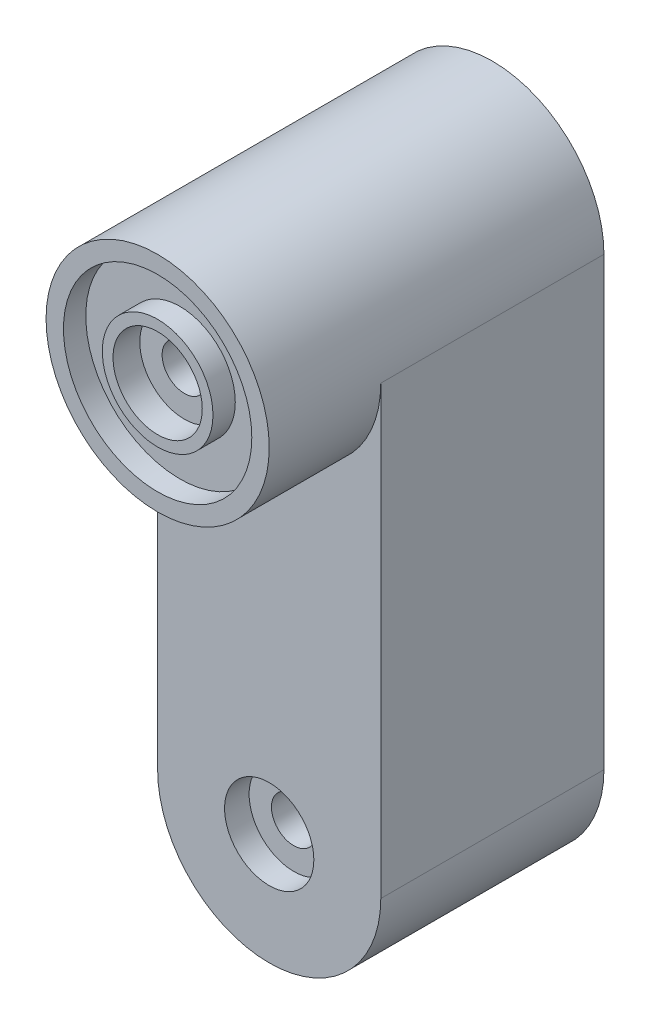
ISO-10303-21;
HEADER;
FILE_DESCRIPTION(('STEP AP214'),'2;1');
FILE_NAME('part.step','',(''),(''),'','','');
FILE_SCHEMA(('AUTOMOTIVE_DESIGN { 1 0 10303 214 1 1 1 1 }'));
ENDSEC;
DATA;
#1=APPLICATION_CONTEXT('core data for automotive mechanical design processes');
#2=APPLICATION_PROTOCOL_DEFINITION('international standard','automotive_design',2000,#1);
#3=PRODUCT_CONTEXT('',#1,'mechanical');
#4=PRODUCT('Part','Part','',(#3));
#5=PRODUCT_RELATED_PRODUCT_CATEGORY('part','',(#4));
#6=PRODUCT_DEFINITION_FORMATION('','',#4);
#7=PRODUCT_DEFINITION_CONTEXT('part definition',#1,'design');
#8=PRODUCT_DEFINITION('design','',#6,#7);
#9=PRODUCT_DEFINITION_SHAPE('','',#8);
#10=(LENGTH_UNIT() NAMED_UNIT(*) SI_UNIT(.MILLI.,.METRE.));
#11=(NAMED_UNIT(*) PLANE_ANGLE_UNIT() SI_UNIT($,.RADIAN.));
#12=(NAMED_UNIT(*) SI_UNIT($,.STERADIAN.) SOLID_ANGLE_UNIT());
#13=UNCERTAINTY_MEASURE_WITH_UNIT(LENGTH_MEASURE(1.E-05),#10,'distance_accuracy_value','');
#14=(GEOMETRIC_REPRESENTATION_CONTEXT(3) GLOBAL_UNCERTAINTY_ASSIGNED_CONTEXT((#13)) GLOBAL_UNIT_ASSIGNED_CONTEXT((#10,
#11,#12)) REPRESENTATION_CONTEXT('',''));
#15=CARTESIAN_POINT('',(0.,0.,0.));
#16=DIRECTION('',(0.,0.,1.));
#17=DIRECTION('',(1.,0.,0.));
#18=AXIS2_PLACEMENT_3D('',#15,#16,#17);
#19=CARTESIAN_POINT('',(0.,25.,-25.0000000000001));
#20=DIRECTION('',(0.,0.,1.));
#21=DIRECTION('',(1.,0.,0.));
#22=AXIS2_PLACEMENT_3D('',#19,#20,#21);
#23=CYLINDRICAL_SURFACE('',#22,5.);
#24=CARTESIAN_POINT('',(0.,25.,-19.5000000000001));
#25=DIRECTION('',(0.,0.,-1.));
#26=DIRECTION('',(-1.,0.,0.));
#27=AXIS2_PLACEMENT_3D('',#24,#25,#26);
#28=CIRCLE('',#27,5.);
#29=CARTESIAN_POINT('',(-4.99999999999997,25.,-19.5000000000001));
#30=VERTEX_POINT('',#29);
#31=EDGE_CURVE('E198',#30,#30,#28,.F.);
#32=ORIENTED_EDGE('',*,*,#31,.F.);
#33=EDGE_LOOP('',(#32));
#34=FACE_BOUND('',#33,.T.);
#35=CARTESIAN_POINT('',(0.,25.,19.4999999999999));
#36=DIRECTION('',(0.,0.,1.));
#37=DIRECTION('',(1.,0.,0.));
#38=AXIS2_PLACEMENT_3D('',#35,#36,#37);
#39=CIRCLE('',#38,5.);
#40=CARTESIAN_POINT('',(5.00000000000003,25.,19.4999999999999));
#41=VERTEX_POINT('',#40);
#42=EDGE_CURVE('E127',#41,#41,#39,.F.);
#43=ORIENTED_EDGE('',*,*,#42,.F.);
#44=EDGE_LOOP('',(#43));
#45=FACE_BOUND('',#44,.T.);
#46=ADVANCED_FACE('F123',(#34,#45),#23,.F.);
#47=CARTESIAN_POINT('',(0.,125.000000000001,-25.0000000000001));
#48=DIRECTION('',(0.,0.,1.));
#49=DIRECTION('',(1.,0.,0.));
#50=AXIS2_PLACEMENT_3D('',#47,#48,#49);
#51=CYLINDRICAL_SURFACE('',#50,5.);
#52=CARTESIAN_POINT('',(0.,125.000000000001,-19.5000000000001));
#53=DIRECTION('',(0.,0.,-1.));
#54=DIRECTION('',(-1.,0.,0.));
#55=AXIS2_PLACEMENT_3D('',#52,#53,#54);
#56=CIRCLE('',#55,5.);
#57=CARTESIAN_POINT('',(-4.99999999999998,125.000000000001,-19.5000000000001));
#58=VERTEX_POINT('',#57);
#59=EDGE_CURVE('E201',#58,#58,#56,.F.);
#60=ORIENTED_EDGE('',*,*,#59,.F.);
#61=EDGE_LOOP('',(#60));
#62=FACE_BOUND('',#61,.T.);
#63=CARTESIAN_POINT('',(0.,125.000000000001,43.9999999999999));
#64=DIRECTION('',(0.,0.,1.));
#65=DIRECTION('',(1.,0.,0.));
#66=AXIS2_PLACEMENT_3D('',#63,#64,#65);
#67=CIRCLE('',#66,5.);
#68=CARTESIAN_POINT('',(5.00000000000002,125.000000000001,43.9999999999999));
#69=VERTEX_POINT('',#68);
#70=EDGE_CURVE('E205',#69,#69,#67,.F.);
#71=ORIENTED_EDGE('',*,*,#70,.F.);
#72=EDGE_LOOP('',(#71));
#73=FACE_BOUND('',#72,.T.);
#74=ADVANCED_FACE('F263',(#62,#73),#51,.F.);
#75=CARTESIAN_POINT('',(0.,0.,49.9999999999999));
#76=DIRECTION('',(0.,0.,1.));
#77=DIRECTION('',(1.,0.,0.));
#78=AXIS2_PLACEMENT_3D('',#75,#76,#77);
#79=PLANE('',#78);
#80=CARTESIAN_POINT('',(0.,125.000000000001,49.9999999999999));
#81=DIRECTION('',(0.,0.,1.));
#82=DIRECTION('',(1.,0.,0.));
#83=AXIS2_PLACEMENT_3D('',#80,#81,#82);
#84=CIRCLE('',#83,10.);
#85=CARTESIAN_POINT('',(10.,125.000000000001,49.9999999999999));
#86=VERTEX_POINT('',#85);
#87=EDGE_CURVE('E215',#86,#86,#84,.T.);
#88=ORIENTED_EDGE('',*,*,#87,.F.);
#89=EDGE_LOOP('',(#88));
#90=FACE_BOUND('',#89,.T.);
#91=CARTESIAN_POINT('',(0.,125.000000000001,49.9999999999999));
#92=DIRECTION('',(0.,0.,1.));
#93=DIRECTION('',(1.,0.,0.));
#94=AXIS2_PLACEMENT_3D('',#91,#92,#93);
#95=CIRCLE('',#94,12.4);
#96=CARTESIAN_POINT('',(12.4,125.000000000001,49.9999999999999));
#97=VERTEX_POINT('',#96);
#98=EDGE_CURVE('E204',#97,#97,#95,.T.);
#99=ORIENTED_EDGE('',*,*,#98,.T.);
#100=EDGE_LOOP('',(#99));
#101=FACE_BOUND('',#100,.T.);
#102=ADVANCED_FACE('F270',(#90,#101),#79,.T.);
#103=CARTESIAN_POINT('',(0.,125.000000000001,49.9999999999999));
#104=DIRECTION('',(0.,0.,1.));
#105=DIRECTION('',(1.,0.,0.));
#106=AXIS2_PLACEMENT_3D('',#103,#104,#105);
#107=CIRCLE('',#106,21.1);
#108=CARTESIAN_POINT('',(21.1,125.000000000001,49.9999999999999));
#109=VERTEX_POINT('',#108);
#110=EDGE_CURVE('E235',#109,#109,#107,.T.);
#111=ORIENTED_EDGE('',*,*,#110,.F.);
#112=EDGE_LOOP('',(#111));
#113=FACE_BOUND('',#112,.T.);
#114=CARTESIAN_POINT('',(0.,125.000000000001,49.9999999999999));
#115=DIRECTION('',(0.,0.,1.));
#116=DIRECTION('',(1.,0.,0.));
#117=AXIS2_PLACEMENT_3D('',#114,#115,#116);
#118=CIRCLE('',#117,24.9999999999994);
#119=CARTESIAN_POINT('',(24.9999999999994,125.000000000001,49.9999999999999));
#120=VERTEX_POINT('',#119);
#121=EDGE_CURVE('E181',#120,#120,#118,.T.);
#122=ORIENTED_EDGE('',*,*,#121,.T.);
#123=EDGE_LOOP('',(#122));
#124=FACE_BOUND('',#123,.T.);
#125=ADVANCED_FACE('F332',(#113,#124),#79,.T.);
#126=CARTESIAN_POINT('',(-25.,150.,-25.0000000000001));
#127=DIRECTION('',(0.,0.,1.));
#128=DIRECTION('',(1.,0.,0.));
#129=AXIS2_PLACEMENT_3D('',#126,#127,#128);
#130=PLANE('',#129);
#131=CARTESIAN_POINT('',(0.,125.000000000001,-25.0000000000001));
#132=DIRECTION('',(0.,0.,-1.));
#133=DIRECTION('',(-1.,0.,0.));
#134=AXIS2_PLACEMENT_3D('',#131,#132,#133);
#135=CIRCLE('',#134,10.2);
#136=CARTESIAN_POINT('',(-10.2,125.000000000001,-25.0000000000001));
#137=VERTEX_POINT('',#136);
#138=EDGE_CURVE('E227',#137,#137,#135,.T.);
#139=ORIENTED_EDGE('',*,*,#138,.F.);
#140=EDGE_LOOP('',(#139));
#141=FACE_BOUND('',#140,.T.);
#142=CARTESIAN_POINT('',(0.,25.,-25.0000000000001));
#143=DIRECTION('',(0.,0.,-1.));
#144=DIRECTION('',(-1.,0.,0.));
#145=AXIS2_PLACEMENT_3D('',#142,#143,#144);
#146=CIRCLE('',#145,10.);
#147=CARTESIAN_POINT('',(-9.99999999999997,25.,-25.0000000000001));
#148=VERTEX_POINT('',#147);
#149=EDGE_CURVE('E212',#148,#148,#146,.T.);
#150=ORIENTED_EDGE('',*,*,#149,.F.);
#151=EDGE_LOOP('',(#150));
#152=FACE_BOUND('',#151,.T.);
#153=CARTESIAN_POINT('',(0.,125.000000000001,-25.0000000000001));
#154=DIRECTION('',(0.,0.,1.));
#155=DIRECTION('',(1.,0.,0.));
#156=AXIS2_PLACEMENT_3D('',#153,#154,#155);
#157=CIRCLE('',#156,24.9999999999994);
#158=CARTESIAN_POINT('',(-25.,125.000000000001,-25.0000000000001));
#159=VERTEX_POINT('',#158);
#160=CARTESIAN_POINT('',(25.,125.000000000001,-25.0000000000001));
#161=VERTEX_POINT('',#160);
#162=EDGE_CURVE('E180',#159,#161,#157,.F.);
#163=ORIENTED_EDGE('',*,*,#162,.T.);
#164=DIRECTION('',(0.,-1.,0.));
#165=VECTOR('',#164,1.);
#166=CARTESIAN_POINT('',(25.,150.,-25.0000000000001));
#167=LINE('',#166,#165);
#168=CARTESIAN_POINT('',(25.,25.,-25.0000000000001));
#169=VERTEX_POINT('',#168);
#170=EDGE_CURVE('E12',#161,#169,#167,.T.);
#171=ORIENTED_EDGE('',*,*,#170,.T.);
#172=CARTESIAN_POINT('',(0.,25.,-25.0000000000001));
#173=DIRECTION('',(0.,0.,1.));
#174=DIRECTION('',(1.,0.,0.));
#175=AXIS2_PLACEMENT_3D('',#172,#173,#174);
#176=CIRCLE('',#175,25.);
#177=CARTESIAN_POINT('',(-25.,25.,-25.0000000000001));
#178=VERTEX_POINT('',#177);
#179=EDGE_CURVE('E191',#178,#169,#176,.T.);
#180=ORIENTED_EDGE('',*,*,#179,.F.);
#181=DIRECTION('',(0.,-1.,0.));
#182=VECTOR('',#181,1.);
#183=CARTESIAN_POINT('',(-25.,150.,-25.0000000000001));
#184=LINE('',#183,#182);
#185=EDGE_CURVE('E132',#159,#178,#184,.T.);
#186=ORIENTED_EDGE('',*,*,#185,.F.);
#187=EDGE_LOOP('',(#163,#171,#180,#186));
#188=FACE_BOUND('',#187,.T.);
#189=ADVANCED_FACE('F247',(#141,#152,#188),#130,.F.);
#190=CARTESIAN_POINT('',(-25.,150.,24.9999999999999));
#191=DIRECTION('',(1.,0.,0.));
#192=DIRECTION('',(0.,0.,-1.));
#193=AXIS2_PLACEMENT_3D('',#190,#191,#192);
#194=PLANE('',#193);
#195=DIRECTION('',(0.,-1.,0.));
#196=VECTOR('',#195,1.);
#197=CARTESIAN_POINT('',(-25.,150.,24.9999999999999));
#198=LINE('',#197,#196);
#199=CARTESIAN_POINT('',(-25.,125.000000000001,24.9999999999999));
#200=VERTEX_POINT('',#199);
#201=CARTESIAN_POINT('',(-25.,25.,24.9999999999999));
#202=VERTEX_POINT('',#201);
#203=EDGE_CURVE('E165',#200,#202,#198,.T.);
#204=ORIENTED_EDGE('',*,*,#203,.F.);
#205=DIRECTION('',(0.,0.,1.));
#206=VECTOR('',#205,1.);
#207=CARTESIAN_POINT('',(-25.,125.000000000001,-60.355339059327));
#208=LINE('',#207,#206);
#209=EDGE_CURVE('E168',#159,#200,#208,.T.);
#210=ORIENTED_EDGE('',*,*,#209,.F.);
#211=ORIENTED_EDGE('',*,*,#185,.T.);
#212=DIRECTION('',(0.,0.,1.));
#213=VECTOR('',#212,1.);
#214=CARTESIAN_POINT('',(-25.,25.,-25.0000000000001));
#215=LINE('',#214,#213);
#216=EDGE_CURVE('E169',#178,#202,#215,.T.);
#217=ORIENTED_EDGE('',*,*,#216,.T.);
#218=EDGE_LOOP('',(#204,#210,#211,#217));
#219=FACE_BOUND('',#218,.T.);
#220=ADVANCED_FACE('F166',(#219),#194,.F.);
#221=CARTESIAN_POINT('',(-25.,150.,24.9999999999999));
#222=DIRECTION('',(0.,0.,-1.));
#223=DIRECTION('',(-1.,0.,0.));
#224=AXIS2_PLACEMENT_3D('',#221,#222,#223);
#225=PLANE('',#224);
#226=CARTESIAN_POINT('',(0.,25.,24.9999999999999));
#227=DIRECTION('',(0.,0.,1.));
#228=DIRECTION('',(1.,0.,0.));
#229=AXIS2_PLACEMENT_3D('',#226,#227,#228);
#230=CIRCLE('',#229,9.99999999999999);
#231=CARTESIAN_POINT('',(10.,25.,24.9999999999999));
#232=VERTEX_POINT('',#231);
#233=EDGE_CURVE('E222',#232,#232,#230,.T.);
#234=ORIENTED_EDGE('',*,*,#233,.F.);
#235=EDGE_LOOP('',(#234));
#236=FACE_BOUND('',#235,.T.);
#237=CARTESIAN_POINT('',(0.,25.,24.9999999999999));
#238=DIRECTION('',(0.,0.,1.));
#239=DIRECTION('',(1.,0.,0.));
#240=AXIS2_PLACEMENT_3D('',#237,#238,#239);
#241=CIRCLE('',#240,25.);
#242=CARTESIAN_POINT('',(25.,25.,24.9999999999999));
#243=VERTEX_POINT('',#242);
#244=EDGE_CURVE('E190',#202,#243,#241,.T.);
#245=ORIENTED_EDGE('',*,*,#244,.T.);
#246=DIRECTION('',(0.,-1.,0.));
#247=VECTOR('',#246,1.);
#248=CARTESIAN_POINT('',(25.,150.,24.9999999999999));
#249=LINE('',#248,#247);
#250=CARTESIAN_POINT('',(25.,125.000000000001,24.9999999999999));
#251=VERTEX_POINT('',#250);
#252=EDGE_CURVE('E140',#251,#243,#249,.T.);
#253=ORIENTED_EDGE('',*,*,#252,.F.);
#254=CARTESIAN_POINT('',(0.,125.000000000001,24.9999999999999));
#255=DIRECTION('',(0.,0.,-1.));
#256=DIRECTION('',(-1.,0.,0.));
#257=AXIS2_PLACEMENT_3D('',#254,#255,#256);
#258=CIRCLE('',#257,25.0000000000006);
#259=EDGE_CURVE('E171',#200,#251,#258,.F.);
#260=ORIENTED_EDGE('',*,*,#259,.F.);
#261=ORIENTED_EDGE('',*,*,#203,.T.);
#262=EDGE_LOOP('',(#245,#253,#260,#261));
#263=FACE_BOUND('',#262,.T.);
#264=ADVANCED_FACE('F172',(#236,#263),#225,.F.);
#265=CARTESIAN_POINT('',(25.,150.,24.9999999999999));
#266=DIRECTION('',(-1.,0.,0.));
#267=DIRECTION('',(0.,0.,1.));
#268=AXIS2_PLACEMENT_3D('',#265,#266,#267);
#269=PLANE('',#268);
#270=DIRECTION('',(0.,0.,1.));
#271=VECTOR('',#270,1.);
#272=CARTESIAN_POINT('',(25.,125.000000000001,-60.355339059327));
#273=LINE('',#272,#271);
#274=EDGE_CURVE('E176',#161,#251,#273,.T.);
#275=ORIENTED_EDGE('',*,*,#274,.T.);
#276=ORIENTED_EDGE('',*,*,#252,.T.);
#277=DIRECTION('',(0.,0.,1.));
#278=VECTOR('',#277,1.);
#279=CARTESIAN_POINT('',(25.,25.,-25.0000000000001));
#280=LINE('',#279,#278);
#281=EDGE_CURVE('E183',#169,#243,#280,.T.);
#282=ORIENTED_EDGE('',*,*,#281,.F.);
#283=ORIENTED_EDGE('',*,*,#170,.F.);
#284=EDGE_LOOP('',(#275,#276,#282,#283));
#285=FACE_BOUND('',#284,.T.);
#286=ADVANCED_FACE('F125',(#285),#269,.F.);
#287=CARTESIAN_POINT('',(0.,25.,-25.0000000000001));
#288=DIRECTION('',(0.,0.,1.));
#289=DIRECTION('',(1.,0.,0.));
#290=AXIS2_PLACEMENT_3D('',#287,#288,#289);
#291=CYLINDRICAL_SURFACE('',#290,25.);
#292=ORIENTED_EDGE('',*,*,#244,.F.);
#293=ORIENTED_EDGE('',*,*,#216,.F.);
#294=ORIENTED_EDGE('',*,*,#179,.T.);
#295=ORIENTED_EDGE('',*,*,#281,.T.);
#296=EDGE_LOOP('',(#292,#293,#294,#295));
#297=FACE_BOUND('',#296,.T.);
#298=ADVANCED_FACE('F249',(#297),#291,.T.);
#299=CARTESIAN_POINT('',(0.,125.000000000001,-60.355339059327));
#300=DIRECTION('',(0.,0.,1.));
#301=DIRECTION('',(1.,0.,0.));
#302=AXIS2_PLACEMENT_3D('',#299,#300,#301);
#303=CYLINDRICAL_SURFACE('',#302,24.9999999999994);
#304=ORIENTED_EDGE('',*,*,#121,.F.);
#305=EDGE_LOOP('',(#304));
#306=FACE_BOUND('',#305,.T.);
#307=ORIENTED_EDGE('',*,*,#209,.T.);
#308=ORIENTED_EDGE('',*,*,#259,.T.);
#309=ORIENTED_EDGE('',*,*,#274,.F.);
#310=ORIENTED_EDGE('',*,*,#162,.F.);
#311=EDGE_LOOP('',(#307,#308,#309,#310));
#312=FACE_BOUND('',#311,.T.);
#313=ADVANCED_FACE('F179',(#306,#312),#303,.T.);
#314=CARTESIAN_POINT('',(0.,125.000000000001,44.9999999999999));
#315=DIRECTION('',(0.,0.,1.));
#316=DIRECTION('',(1.,0.,0.));
#317=AXIS2_PLACEMENT_3D('',#314,#315,#316);
#318=CYLINDRICAL_SURFACE('',#317,21.1);
#319=CARTESIAN_POINT('',(0.,125.000000000001,44.9999999999999));
#320=DIRECTION('',(0.,0.,1.));
#321=DIRECTION('',(1.,0.,0.));
#322=AXIS2_PLACEMENT_3D('',#319,#320,#321);
#323=CIRCLE('',#322,21.1);
#324=CARTESIAN_POINT('',(21.1,125.000000000001,44.9999999999999));
#325=VERTEX_POINT('',#324);
#326=EDGE_CURVE('E177',#325,#325,#323,.T.);
#327=ORIENTED_EDGE('',*,*,#326,.F.);
#328=EDGE_LOOP('',(#327));
#329=FACE_BOUND('',#328,.T.);
#330=ORIENTED_EDGE('',*,*,#110,.T.);
#331=EDGE_LOOP('',(#330));
#332=FACE_BOUND('',#331,.T.);
#333=ADVANCED_FACE('F256',(#329,#332),#318,.F.);
#334=CARTESIAN_POINT('',(0.,125.000000000001,44.9999999999999));
#335=DIRECTION('',(0.,0.,1.));
#336=DIRECTION('',(1.,0.,0.));
#337=AXIS2_PLACEMENT_3D('',#334,#335,#336);
#338=PLANE('',#337);
#339=CARTESIAN_POINT('',(0.,125.000000000001,44.9999999999999));
#340=DIRECTION('',(0.,0.,1.));
#341=DIRECTION('',(1.,0.,0.));
#342=AXIS2_PLACEMENT_3D('',#339,#340,#341);
#343=CIRCLE('',#342,12.4);
#344=CARTESIAN_POINT('',(12.4,125.000000000001,44.9999999999999));
#345=VERTEX_POINT('',#344);
#346=EDGE_CURVE('E232',#345,#345,#343,.T.);
#347=ORIENTED_EDGE('',*,*,#346,.F.);
#348=EDGE_LOOP('',(#347));
#349=FACE_BOUND('',#348,.T.);
#350=ORIENTED_EDGE('',*,*,#326,.T.);
#351=EDGE_LOOP('',(#350));
#352=FACE_BOUND('',#351,.T.);
#353=ADVANCED_FACE('F277',(#349,#352),#338,.T.);
#354=CARTESIAN_POINT('',(0.,125.000000000001,44.9999999999999));
#355=DIRECTION('',(0.,0.,1.));
#356=DIRECTION('',(1.,0.,0.));
#357=AXIS2_PLACEMENT_3D('',#354,#355,#356);
#358=CYLINDRICAL_SURFACE('',#357,12.4);
#359=ORIENTED_EDGE('',*,*,#346,.T.);
#360=EDGE_LOOP('',(#359));
#361=FACE_BOUND('',#360,.T.);
#362=ORIENTED_EDGE('',*,*,#98,.F.);
#363=EDGE_LOOP('',(#362));
#364=FACE_BOUND('',#363,.T.);
#365=ADVANCED_FACE('F281',(#361,#364),#358,.T.);
#366=CARTESIAN_POINT('',(0.,25.,-19.5000000000001));
#367=DIRECTION('',(0.,0.,-1.));
#368=DIRECTION('',(-1.,0.,0.));
#369=AXIS2_PLACEMENT_3D('',#366,#367,#368);
#370=PLANE('',#369);
#371=CARTESIAN_POINT('',(0.,25.,-19.5000000000001));
#372=DIRECTION('',(0.,0.,-1.));
#373=DIRECTION('',(-1.,0.,0.));
#374=AXIS2_PLACEMENT_3D('',#371,#372,#373);
#375=CIRCLE('',#374,10.);
#376=CARTESIAN_POINT('',(-9.99999999999997,25.,-19.5000000000001));
#377=VERTEX_POINT('',#376);
#378=EDGE_CURVE('E207',#377,#377,#375,.T.);
#379=ORIENTED_EDGE('',*,*,#378,.T.);
#380=EDGE_LOOP('',(#379));
#381=FACE_BOUND('',#380,.T.);
#382=ORIENTED_EDGE('',*,*,#31,.T.);
#383=EDGE_LOOP('',(#382));
#384=FACE_BOUND('',#383,.T.);
#385=ADVANCED_FACE('F285',(#381,#384),#370,.T.);
#386=CARTESIAN_POINT('',(0.,25.,-19.5000000000001));
#387=DIRECTION('',(0.,0.,-1.));
#388=DIRECTION('',(-1.,0.,0.));
#389=AXIS2_PLACEMENT_3D('',#386,#387,#388);
#390=CYLINDRICAL_SURFACE('',#389,10.);
#391=ORIENTED_EDGE('',*,*,#378,.F.);
#392=EDGE_LOOP('',(#391));
#393=FACE_BOUND('',#392,.T.);
#394=ORIENTED_EDGE('',*,*,#149,.T.);
#395=EDGE_LOOP('',(#394));
#396=FACE_BOUND('',#395,.T.);
#397=ADVANCED_FACE('F289',(#393,#396),#390,.F.);
#398=CARTESIAN_POINT('',(0.,125.000000000001,-19.5000000000001));
#399=DIRECTION('',(0.,0.,-1.));
#400=DIRECTION('',(-1.,0.,0.));
#401=AXIS2_PLACEMENT_3D('',#398,#399,#400);
#402=PLANE('',#401);
#403=CARTESIAN_POINT('',(0.,125.000000000001,-19.5000000000001));
#404=DIRECTION('',(0.,0.,-1.));
#405=DIRECTION('',(-1.,0.,0.));
#406=AXIS2_PLACEMENT_3D('',#403,#404,#405);
#407=CIRCLE('',#406,10.2);
#408=CARTESIAN_POINT('',(-10.2,125.000000000001,-19.5000000000001));
#409=VERTEX_POINT('',#408);
#410=EDGE_CURVE('E202',#409,#409,#407,.T.);
#411=ORIENTED_EDGE('',*,*,#410,.T.);
#412=EDGE_LOOP('',(#411));
#413=FACE_BOUND('',#412,.T.);
#414=ORIENTED_EDGE('',*,*,#59,.T.);
#415=EDGE_LOOP('',(#414));
#416=FACE_BOUND('',#415,.T.);
#417=ADVANCED_FACE('F293',(#413,#416),#402,.T.);
#418=CARTESIAN_POINT('',(0.,125.000000000001,-19.5000000000001));
#419=DIRECTION('',(0.,0.,-1.));
#420=DIRECTION('',(-1.,0.,0.));
#421=AXIS2_PLACEMENT_3D('',#418,#419,#420);
#422=CYLINDRICAL_SURFACE('',#421,10.2);
#423=ORIENTED_EDGE('',*,*,#410,.F.);
#424=EDGE_LOOP('',(#423));
#425=FACE_BOUND('',#424,.T.);
#426=ORIENTED_EDGE('',*,*,#138,.T.);
#427=EDGE_LOOP('',(#426));
#428=FACE_BOUND('',#427,.T.);
#429=ADVANCED_FACE('F295',(#425,#428),#422,.F.);
#430=CARTESIAN_POINT('',(0.,125.000000000001,43.9999999999999));
#431=DIRECTION('',(0.,0.,1.));
#432=DIRECTION('',(1.,0.,0.));
#433=AXIS2_PLACEMENT_3D('',#430,#431,#432);
#434=PLANE('',#433);
#435=CARTESIAN_POINT('',(0.,125.000000000001,43.9999999999999));
#436=DIRECTION('',(0.,0.,1.));
#437=DIRECTION('',(1.,0.,0.));
#438=AXIS2_PLACEMENT_3D('',#435,#436,#437);
#439=CIRCLE('',#438,10.);
#440=CARTESIAN_POINT('',(10.,125.000000000001,43.9999999999999));
#441=VERTEX_POINT('',#440);
#442=EDGE_CURVE('E208',#441,#441,#439,.T.);
#443=ORIENTED_EDGE('',*,*,#442,.T.);
#444=EDGE_LOOP('',(#443));
#445=FACE_BOUND('',#444,.T.);
#446=ORIENTED_EDGE('',*,*,#70,.T.);
#447=EDGE_LOOP('',(#446));
#448=FACE_BOUND('',#447,.T.);
#449=ADVANCED_FACE('F298',(#445,#448),#434,.T.);
#450=CARTESIAN_POINT('',(0.,125.000000000001,43.9999999999999));
#451=DIRECTION('',(0.,0.,1.));
#452=DIRECTION('',(1.,0.,0.));
#453=AXIS2_PLACEMENT_3D('',#450,#451,#452);
#454=CYLINDRICAL_SURFACE('',#453,10.);
#455=ORIENTED_EDGE('',*,*,#442,.F.);
#456=EDGE_LOOP('',(#455));
#457=FACE_BOUND('',#456,.T.);
#458=ORIENTED_EDGE('',*,*,#87,.T.);
#459=EDGE_LOOP('',(#458));
#460=FACE_BOUND('',#459,.T.);
#461=ADVANCED_FACE('F303',(#457,#460),#454,.F.);
#462=CARTESIAN_POINT('',(0.,25.,19.4999999999999));
#463=DIRECTION('',(0.,0.,1.));
#464=DIRECTION('',(1.,0.,0.));
#465=AXIS2_PLACEMENT_3D('',#462,#463,#464);
#466=PLANE('',#465);
#467=CARTESIAN_POINT('',(0.,25.,19.4999999999999));
#468=DIRECTION('',(0.,0.,1.));
#469=DIRECTION('',(1.,0.,0.));
#470=AXIS2_PLACEMENT_3D('',#467,#468,#469);
#471=CIRCLE('',#470,9.99999999999999);
#472=CARTESIAN_POINT('',(10.,25.,19.4999999999999));
#473=VERTEX_POINT('',#472);
#474=EDGE_CURVE('E320',#473,#473,#471,.T.);
#475=ORIENTED_EDGE('',*,*,#474,.T.);
#476=EDGE_LOOP('',(#475));
#477=FACE_BOUND('',#476,.T.);
#478=ORIENTED_EDGE('',*,*,#42,.T.);
#479=EDGE_LOOP('',(#478));
#480=FACE_BOUND('',#479,.T.);
#481=ADVANCED_FACE('F305',(#477,#480),#466,.T.);
#482=CARTESIAN_POINT('',(0.,25.,19.4999999999999));
#483=DIRECTION('',(0.,0.,1.));
#484=DIRECTION('',(1.,0.,0.));
#485=AXIS2_PLACEMENT_3D('',#482,#483,#484);
#486=CYLINDRICAL_SURFACE('',#485,9.99999999999999);
#487=ORIENTED_EDGE('',*,*,#474,.F.);
#488=EDGE_LOOP('',(#487));
#489=FACE_BOUND('',#488,.T.);
#490=ORIENTED_EDGE('',*,*,#233,.T.);
#491=EDGE_LOOP('',(#490));
#492=FACE_BOUND('',#491,.T.);
#493=ADVANCED_FACE('F309',(#489,#492),#486,.F.);
#494=CLOSED_SHELL('',(#46,#74,#102,#125,#189,#220,#264,#286,#298,#313,#333,#353,#365,#385,#397,
#417,#429,#449,#461,#481,#493));
#495=MANIFOLD_SOLID_BREP('B2',#494);
#496=ADVANCED_BREP_SHAPE_REPRESENTATION('',(#18,#495),#14);
#497=SHAPE_DEFINITION_REPRESENTATION(#9,#496);
ENDSEC;
END-ISO-10303-21;
